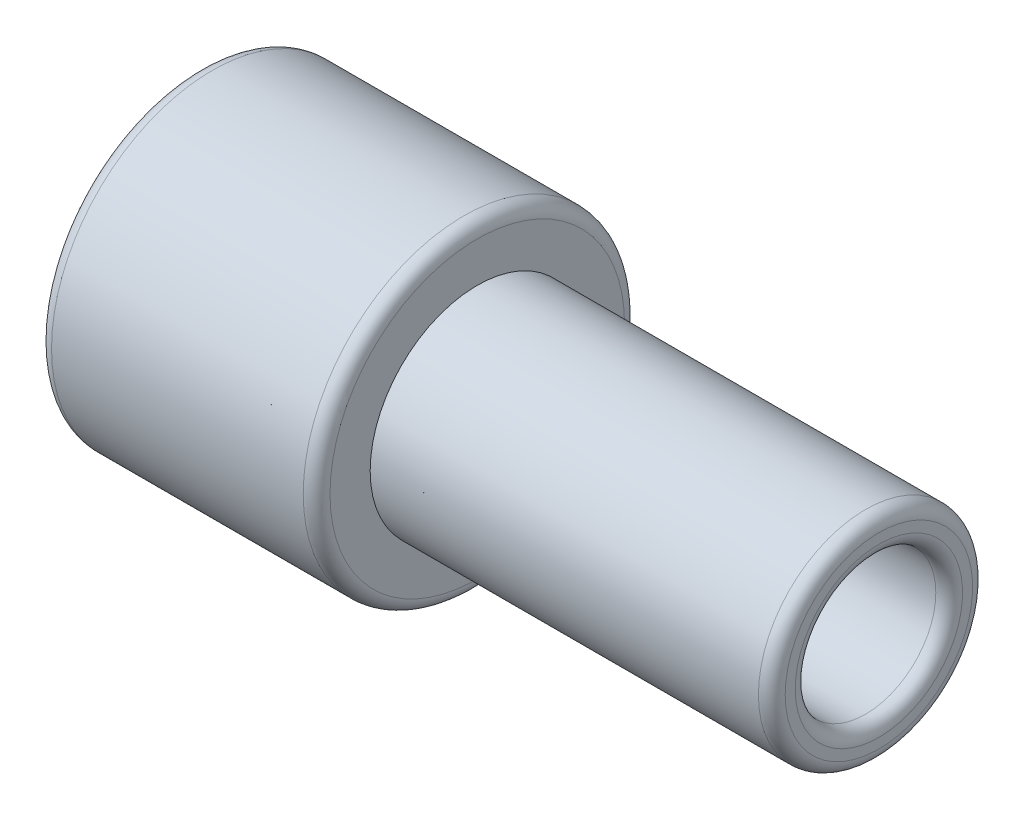
ISO-10303-21;
HEADER;
FILE_DESCRIPTION(('STEP AP214'),'2;1');
FILE_NAME('part.step','',(''),(''),'','','');
FILE_SCHEMA(('AUTOMOTIVE_DESIGN { 1 0 10303 214 1 1 1 1 }'));
ENDSEC;
DATA;
#1=APPLICATION_CONTEXT('core data for automotive mechanical design processes');
#2=APPLICATION_PROTOCOL_DEFINITION('international standard','automotive_design',2000,#1);
#3=PRODUCT_CONTEXT('',#1,'mechanical');
#4=PRODUCT('Part','Part','',(#3));
#5=PRODUCT_RELATED_PRODUCT_CATEGORY('part','',(#4));
#6=PRODUCT_DEFINITION_FORMATION('','',#4);
#7=PRODUCT_DEFINITION_CONTEXT('part definition',#1,'design');
#8=PRODUCT_DEFINITION('design','',#6,#7);
#9=PRODUCT_DEFINITION_SHAPE('','',#8);
#10=(LENGTH_UNIT() NAMED_UNIT(*) SI_UNIT(.MILLI.,.METRE.));
#11=(NAMED_UNIT(*) PLANE_ANGLE_UNIT() SI_UNIT($,.RADIAN.));
#12=(NAMED_UNIT(*) SI_UNIT($,.STERADIAN.) SOLID_ANGLE_UNIT());
#13=UNCERTAINTY_MEASURE_WITH_UNIT(LENGTH_MEASURE(1.E-05),#10,'distance_accuracy_value','');
#14=(GEOMETRIC_REPRESENTATION_CONTEXT(3) GLOBAL_UNCERTAINTY_ASSIGNED_CONTEXT((#13)) GLOBAL_UNIT_ASSIGNED_CONTEXT((#10,
#11,#12)) REPRESENTATION_CONTEXT('',''));
#15=CARTESIAN_POINT('',(0.,0.,0.));
#16=DIRECTION('',(0.,0.,1.));
#17=DIRECTION('',(1.,0.,0.));
#18=AXIS2_PLACEMENT_3D('',#15,#16,#17);
#19=CARTESIAN_POINT('',(11.4,0.,0.));
#20=DIRECTION('',(-1.,0.,0.));
#21=DIRECTION('',(0.,0.,1.));
#22=AXIS2_PLACEMENT_3D('',#19,#20,#21);
#23=PLANE('',#22);
#24=CARTESIAN_POINT('',(11.4,0.,0.));
#25=DIRECTION('',(-1.,0.,0.));
#26=DIRECTION('',(0.,0.,1.));
#27=AXIS2_PLACEMENT_3D('',#24,#25,#26);
#28=CIRCLE('',#27,3.50000000000001);
#29=CARTESIAN_POINT('',(11.4,0.,3.50000000000001));
#30=VERTEX_POINT('',#29);
#31=EDGE_CURVE('E62',#30,#30,#28,.F.);
#32=ORIENTED_EDGE('',*,*,#31,.T.);
#33=EDGE_LOOP('',(#32));
#34=FACE_BOUND('',#33,.T.);
#35=CARTESIAN_POINT('',(11.4,0.,0.));
#36=DIRECTION('',(-1.,0.,0.));
#37=DIRECTION('',(0.,0.,1.));
#38=AXIS2_PLACEMENT_3D('',#35,#36,#37);
#39=CIRCLE('',#38,3.125);
#40=CARTESIAN_POINT('',(11.4,0.,3.125));
#41=VERTEX_POINT('',#40);
#42=EDGE_CURVE('E65',#41,#41,#39,.T.);
#43=ORIENTED_EDGE('',*,*,#42,.T.);
#44=EDGE_LOOP('',(#43));
#45=FACE_BOUND('',#44,.T.);
#46=ADVANCED_FACE('F33',(#34,#45),#23,.F.);
#47=CARTESIAN_POINT('',(-1.17432348671967,0.,0.));
#48=DIRECTION('',(-1.,0.,0.));
#49=DIRECTION('',(0.,0.,1.));
#50=AXIS2_PLACEMENT_3D('',#47,#48,#49);
#51=CYLINDRICAL_SURFACE('',#50,4.00000000000001);
#52=CARTESIAN_POINT('',(10.9,0.,0.));
#53=DIRECTION('',(-1.,0.,0.));
#54=DIRECTION('',(0.,0.,1.));
#55=AXIS2_PLACEMENT_3D('',#52,#53,#54);
#56=CIRCLE('',#55,4.00000000000001);
#57=CARTESIAN_POINT('',(10.9,0.,4.00000000000001));
#58=VERTEX_POINT('',#57);
#59=EDGE_CURVE('E68',#58,#58,#56,.T.);
#60=ORIENTED_EDGE('',*,*,#59,.T.);
#61=EDGE_LOOP('',(#60));
#62=FACE_BOUND('',#61,.T.);
#63=CARTESIAN_POINT('',(-3.6,0.,0.));
#64=DIRECTION('',(-1.,0.,0.));
#65=DIRECTION('',(0.,0.,1.));
#66=AXIS2_PLACEMENT_3D('',#63,#64,#65);
#67=CIRCLE('',#66,4.00000000000001);
#68=CARTESIAN_POINT('',(-3.6,0.,4.00000000000001));
#69=VERTEX_POINT('',#68);
#70=EDGE_CURVE('E71',#69,#69,#67,.T.);
#71=ORIENTED_EDGE('',*,*,#70,.F.);
#72=EDGE_LOOP('',(#71));
#73=FACE_BOUND('',#72,.T.);
#74=ADVANCED_FACE('F77',(#62,#73),#51,.T.);
#75=CARTESIAN_POINT('',(-3.6,0.,0.));
#76=DIRECTION('',(-1.,0.,0.));
#77=DIRECTION('',(0.,0.,1.));
#78=AXIS2_PLACEMENT_3D('',#75,#76,#77);
#79=PLANE('',#78);
#80=CARTESIAN_POINT('',(-3.6,0.,0.));
#81=DIRECTION('',(-1.,0.,0.));
#82=DIRECTION('',(0.,0.,1.));
#83=AXIS2_PLACEMENT_3D('',#80,#81,#82);
#84=CIRCLE('',#83,5.50000000000001);
#85=CARTESIAN_POINT('',(-3.6,0.,5.50000000000001));
#86=VERTEX_POINT('',#85);
#87=EDGE_CURVE('E44',#86,#86,#84,.F.);
#88=ORIENTED_EDGE('',*,*,#87,.T.);
#89=EDGE_LOOP('',(#88));
#90=FACE_BOUND('',#89,.T.);
#91=ORIENTED_EDGE('',*,*,#70,.T.);
#92=EDGE_LOOP('',(#91));
#93=FACE_BOUND('',#92,.T.);
#94=ADVANCED_FACE('F75',(#90,#93),#79,.F.);
#95=CARTESIAN_POINT('',(-1.17432348671967,0.,0.));
#96=DIRECTION('',(-1.,0.,0.));
#97=DIRECTION('',(0.,0.,1.));
#98=AXIS2_PLACEMENT_3D('',#95,#96,#97);
#99=CYLINDRICAL_SURFACE('',#98,6.00000000000001);
#100=CARTESIAN_POINT('',(-4.1,0.,0.));
#101=DIRECTION('',(-1.,0.,0.));
#102=DIRECTION('',(0.,0.,1.));
#103=AXIS2_PLACEMENT_3D('',#100,#101,#102);
#104=CIRCLE('',#103,6.00000000000001);
#105=CARTESIAN_POINT('',(-4.1,0.,6.00000000000001));
#106=VERTEX_POINT('',#105);
#107=EDGE_CURVE('E48',#106,#106,#104,.T.);
#108=ORIENTED_EDGE('',*,*,#107,.T.);
#109=EDGE_LOOP('',(#108));
#110=FACE_BOUND('',#109,.T.);
#111=CARTESIAN_POINT('',(-13.5,0.,0.));
#112=DIRECTION('',(1.,0.,0.));
#113=DIRECTION('',(0.,0.,-1.));
#114=AXIS2_PLACEMENT_3D('',#111,#112,#113);
#115=CIRCLE('',#114,6.00000000000001);
#116=CARTESIAN_POINT('',(-13.5,0.,-6.00000000000001));
#117=VERTEX_POINT('',#116);
#118=EDGE_CURVE('E53',#117,#117,#115,.T.);
#119=ORIENTED_EDGE('',*,*,#118,.T.);
#120=EDGE_LOOP('',(#119));
#121=FACE_BOUND('',#120,.T.);
#122=ADVANCED_FACE('F85',(#110,#121),#99,.T.);
#123=CARTESIAN_POINT('',(-14.,0.,0.));
#124=DIRECTION('',(1.,0.,0.));
#125=DIRECTION('',(0.,0.,-1.));
#126=AXIS2_PLACEMENT_3D('',#123,#124,#125);
#127=PLANE('',#126);
#128=CARTESIAN_POINT('',(-14.,0.,0.));
#129=DIRECTION('',(1.,0.,0.));
#130=DIRECTION('',(0.,0.,-1.));
#131=AXIS2_PLACEMENT_3D('',#128,#129,#130);
#132=CIRCLE('',#131,5.50000000000001);
#133=CARTESIAN_POINT('',(-14.,0.,-5.50000000000001));
#134=VERTEX_POINT('',#133);
#135=EDGE_CURVE('E10',#134,#134,#132,.F.);
#136=ORIENTED_EDGE('',*,*,#135,.T.);
#137=EDGE_LOOP('',(#136));
#138=FACE_BOUND('',#137,.T.);
#139=CARTESIAN_POINT('',(-14.,0.,0.));
#140=DIRECTION('',(1.,0.,0.));
#141=DIRECTION('',(0.,0.,-1.));
#142=AXIS2_PLACEMENT_3D('',#139,#140,#141);
#143=CIRCLE('',#142,3.125);
#144=CARTESIAN_POINT('',(-14.,0.,-3.125));
#145=VERTEX_POINT('',#144);
#146=EDGE_CURVE('E40',#145,#145,#143,.T.);
#147=ORIENTED_EDGE('',*,*,#146,.T.);
#148=EDGE_LOOP('',(#147));
#149=FACE_BOUND('',#148,.T.);
#150=ADVANCED_FACE('F115',(#138,#149),#127,.F.);
#151=CARTESIAN_POINT('',(-14.,0.,0.));
#152=DIRECTION('',(1.,0.,0.));
#153=DIRECTION('',(0.,0.,-1.));
#154=AXIS2_PLACEMENT_3D('',#151,#152,#153);
#155=CYLINDRICAL_SURFACE('',#154,2.625);
#156=CARTESIAN_POINT('',(10.9,0.,0.));
#157=DIRECTION('',(-1.,0.,0.));
#158=DIRECTION('',(0.,0.,1.));
#159=AXIS2_PLACEMENT_3D('',#156,#157,#158);
#160=CIRCLE('',#159,2.625);
#161=CARTESIAN_POINT('',(10.9,0.,-2.625));
#162=VERTEX_POINT('',#161);
#163=EDGE_CURVE('E56',#162,#162,#160,.F.);
#164=CARTESIAN_POINT('',(-13.5,0.,0.));
#165=DIRECTION('',(1.,0.,0.));
#166=DIRECTION('',(0.,0.,-1.));
#167=AXIS2_PLACEMENT_3D('',#164,#165,#166);
#168=CIRCLE('',#167,2.625);
#169=CARTESIAN_POINT('',(-13.5,0.,-2.625));
#170=VERTEX_POINT('',#169);
#171=EDGE_CURVE('E59',#170,#170,#168,.F.);
#172=CARTESIAN_POINT('',(10.9,0.,-2.625));
#173=CARTESIAN_POINT('',(10.6458333333333,0.,-2.625));
#174=CARTESIAN_POINT('',(10.3916666666667,0.,-2.625));
#175=CARTESIAN_POINT('',(9.88333333333334,0.,-2.625));
#176=CARTESIAN_POINT('',(9.62916666666667,0.,-2.625));
#177=CARTESIAN_POINT('',(9.12083333333334,0.,-2.625));
#178=CARTESIAN_POINT('',(8.86666666666667,0.,-2.625));
#179=CARTESIAN_POINT('',(8.35833333333334,0.,-2.625));
#180=CARTESIAN_POINT('',(8.10416666666667,0.,-2.625));
#181=CARTESIAN_POINT('',(7.59583333333334,0.,-2.625));
#182=CARTESIAN_POINT('',(7.34166666666667,0.,-2.625));
#183=CARTESIAN_POINT('',(6.83333333333334,0.,-2.625));
#184=CARTESIAN_POINT('',(6.57916666666667,0.,-2.625));
#185=CARTESIAN_POINT('',(6.07083333333333,0.,-2.625));
#186=CARTESIAN_POINT('',(5.81666666666667,0.,-2.625));
#187=CARTESIAN_POINT('',(5.30833333333334,0.,-2.625));
#188=CARTESIAN_POINT('',(5.05416666666667,0.,-2.625));
#189=CARTESIAN_POINT('',(4.54583333333334,0.,-2.625));
#190=CARTESIAN_POINT('',(4.29166666666667,0.,-2.625));
#191=CARTESIAN_POINT('',(3.78333333333334,0.,-2.625));
#192=CARTESIAN_POINT('',(3.52916666666667,0.,-2.625));
#193=CARTESIAN_POINT('',(3.02083333333334,0.,-2.625));
#194=CARTESIAN_POINT('',(2.76666666666667,0.,-2.625));
#195=CARTESIAN_POINT('',(2.25833333333333,0.,-2.625));
#196=CARTESIAN_POINT('',(2.00416666666667,0.,-2.625));
#197=CARTESIAN_POINT('',(1.49583333333334,0.,-2.625));
#198=CARTESIAN_POINT('',(1.24166666666667,0.,-2.625));
#199=CARTESIAN_POINT('',(0.733333333333337,0.,-2.625));
#200=CARTESIAN_POINT('',(0.47916666666667,0.,-2.625));
#201=CARTESIAN_POINT('',(-0.029166666666664,0.,-2.625));
#202=CARTESIAN_POINT('',(-0.283333333333331,0.,-2.625));
#203=CARTESIAN_POINT('',(-0.791666666666665,0.,-2.625));
#204=CARTESIAN_POINT('',(-1.04583333333333,0.,-2.625));
#205=CARTESIAN_POINT('',(-1.55416666666666,0.,-2.625));
#206=CARTESIAN_POINT('',(-1.80833333333333,0.,-2.625));
#207=CARTESIAN_POINT('',(-2.31666666666666,0.,-2.625));
#208=CARTESIAN_POINT('',(-2.57083333333333,0.,-2.625));
#209=CARTESIAN_POINT('',(-3.07916666666666,0.,-2.625));
#210=CARTESIAN_POINT('',(-3.33333333333333,0.,-2.625));
#211=CARTESIAN_POINT('',(-3.84166666666667,0.,-2.625));
#212=CARTESIAN_POINT('',(-4.09583333333333,0.,-2.625));
#213=CARTESIAN_POINT('',(-4.60416666666666,0.,-2.625));
#214=CARTESIAN_POINT('',(-4.85833333333333,0.,-2.625));
#215=CARTESIAN_POINT('',(-5.36666666666666,0.,-2.625));
#216=CARTESIAN_POINT('',(-5.62083333333333,0.,-2.625));
#217=CARTESIAN_POINT('',(-6.12916666666667,0.,-2.625));
#218=CARTESIAN_POINT('',(-6.38333333333333,0.,-2.625));
#219=CARTESIAN_POINT('',(-6.89166666666666,0.,-2.625));
#220=CARTESIAN_POINT('',(-7.14583333333333,0.,-2.625));
#221=CARTESIAN_POINT('',(-7.65416666666666,0.,-2.625));
#222=CARTESIAN_POINT('',(-7.90833333333333,0.,-2.625));
#223=CARTESIAN_POINT('',(-8.41666666666666,0.,-2.625));
#224=CARTESIAN_POINT('',(-8.67083333333333,0.,-2.625));
#225=CARTESIAN_POINT('',(-9.17916666666666,0.,-2.625));
#226=CARTESIAN_POINT('',(-9.43333333333333,0.,-2.625));
#227=CARTESIAN_POINT('',(-9.94166666666666,0.,-2.625));
#228=CARTESIAN_POINT('',(-10.1958333333333,0.,-2.625));
#229=CARTESIAN_POINT('',(-10.7041666666667,0.,-2.625));
#230=CARTESIAN_POINT('',(-10.9583333333333,0.,-2.625));
#231=CARTESIAN_POINT('',(-11.4666666666667,0.,-2.625));
#232=CARTESIAN_POINT('',(-11.7208333333333,0.,-2.625));
#233=CARTESIAN_POINT('',(-12.2291666666667,0.,-2.625));
#234=CARTESIAN_POINT('',(-12.4833333333333,0.,-2.625));
#235=CARTESIAN_POINT('',(-12.9916666666667,0.,-2.625));
#236=CARTESIAN_POINT('',(-13.2458333333333,0.,-2.625));
#237=CARTESIAN_POINT('',(-13.5,0.,-2.625));
#238=B_SPLINE_CURVE_WITH_KNOTS('',3,(#172,#173,#174,#175,#176,#177,#178,#179,#180,#181,#182,
#183,#184,#185,#186,#187,#188,#189,#190,#191,#192,#193,#194,#195,#196,#197,#198,#199,#200,#201,
#202,#203,#204,#205,#206,#207,#208,#209,#210,#211,#212,#213,#214,#215,#216,#217,#218,#219,#220,
#221,#222,#223,#224,#225,#226,#227,#228,#229,#230,#231,#232,#233,#234,#235,#236,#237),
.UNSPECIFIED.,.F.,.F.,(4,2,2,2,2,2,2,2,2,2,2,2,2,2,2,2,2,2,2,2,2,2,2,2,2,2,2,2,2,2,2,2,4),(0.,
0.762499999999999,1.525,2.2875,3.05,3.8125,4.575,5.3375,6.1,6.8625,7.625,8.3875,9.15,9.9125,
10.675,11.4375,12.2,12.9625,13.725,14.4875,15.25,16.0125,16.775,17.5375,18.3,19.0625,19.825,
20.5875,21.35,22.1125,22.875,23.6375,24.4),.UNSPECIFIED.);
#239=EDGE_CURVE('BSEAM96',#162,#170,#238,.T.);
#240=ORIENTED_EDGE('',*,*,#163,.T.);
#241=ORIENTED_EDGE('',*,*,#171,.T.);
#242=ORIENTED_EDGE('',*,*,#239,.T.);
#243=ORIENTED_EDGE('',*,*,#239,.F.);
#244=EDGE_LOOP('',(#240,#242,#241,#243));
#245=FACE_BOUND('',#244,.T.);
#246=ADVANCED_FACE('F96',(#245),#155,.F.);
#247=CARTESIAN_POINT('',(10.9,0.,0.));
#248=DIRECTION('',(-1.,0.,0.));
#249=DIRECTION('',(0.,0.,1.));
#250=AXIS2_PLACEMENT_3D('',#247,#248,#249);
#251=TOROIDAL_SURFACE('',#250,3.50000000000001,0.5);
#252=ORIENTED_EDGE('',*,*,#31,.F.);
#253=EDGE_LOOP('',(#252));
#254=FACE_BOUND('',#253,.T.);
#255=ORIENTED_EDGE('',*,*,#59,.F.);
#256=EDGE_LOOP('',(#255));
#257=FACE_BOUND('',#256,.T.);
#258=ADVANCED_FACE('F92',(#254,#257),#251,.T.);
#259=CARTESIAN_POINT('',(10.9,0.,0.));
#260=DIRECTION('',(-1.,0.,0.));
#261=DIRECTION('',(0.,0.,1.));
#262=AXIS2_PLACEMENT_3D('',#259,#260,#261);
#263=TOROIDAL_SURFACE('',#262,3.125,0.5);
#264=ORIENTED_EDGE('',*,*,#42,.F.);
#265=EDGE_LOOP('',(#264));
#266=FACE_BOUND('',#265,.T.);
#267=ORIENTED_EDGE('',*,*,#163,.F.);
#268=EDGE_LOOP('',(#267));
#269=FACE_BOUND('',#268,.T.);
#270=ADVANCED_FACE('F95',(#266,#269),#263,.T.);
#271=CARTESIAN_POINT('',(-4.1,0.,0.));
#272=DIRECTION('',(-1.,0.,0.));
#273=DIRECTION('',(0.,0.,1.));
#274=AXIS2_PLACEMENT_3D('',#271,#272,#273);
#275=TOROIDAL_SURFACE('',#274,5.50000000000001,0.5);
#276=ORIENTED_EDGE('',*,*,#87,.F.);
#277=EDGE_LOOP('',(#276));
#278=FACE_BOUND('',#277,.T.);
#279=ORIENTED_EDGE('',*,*,#107,.F.);
#280=EDGE_LOOP('',(#279));
#281=FACE_BOUND('',#280,.T.);
#282=ADVANCED_FACE('F100',(#278,#281),#275,.T.);
#283=CARTESIAN_POINT('',(-13.5,0.,0.));
#284=DIRECTION('',(1.,0.,0.));
#285=DIRECTION('',(0.,0.,-1.));
#286=AXIS2_PLACEMENT_3D('',#283,#284,#285);
#287=TOROIDAL_SURFACE('',#286,5.50000000000001,0.5);
#288=ORIENTED_EDGE('',*,*,#118,.F.);
#289=EDGE_LOOP('',(#288));
#290=FACE_BOUND('',#289,.T.);
#291=ORIENTED_EDGE('',*,*,#135,.F.);
#292=EDGE_LOOP('',(#291));
#293=FACE_BOUND('',#292,.T.);
#294=ADVANCED_FACE('F103',(#290,#293),#287,.T.);
#295=CARTESIAN_POINT('',(-13.5,0.,0.));
#296=DIRECTION('',(1.,0.,0.));
#297=DIRECTION('',(0.,0.,-1.));
#298=AXIS2_PLACEMENT_3D('',#295,#296,#297);
#299=TOROIDAL_SURFACE('',#298,3.125,0.5);
#300=ORIENTED_EDGE('',*,*,#171,.F.);
#301=EDGE_LOOP('',(#300));
#302=FACE_BOUND('',#301,.T.);
#303=ORIENTED_EDGE('',*,*,#146,.F.);
#304=EDGE_LOOP('',(#303));
#305=FACE_BOUND('',#304,.T.);
#306=ADVANCED_FACE('F35',(#302,#305),#299,.T.);
#307=CLOSED_SHELL('',(#46,#74,#94,#122,#150,#246,#258,#270,#282,#294,#306));
#308=MANIFOLD_SOLID_BREP('B2',#307);
#309=ADVANCED_BREP_SHAPE_REPRESENTATION('',(#18,#308),#14);
#310=SHAPE_DEFINITION_REPRESENTATION(#9,#309);
ENDSEC;
END-ISO-10303-21;
